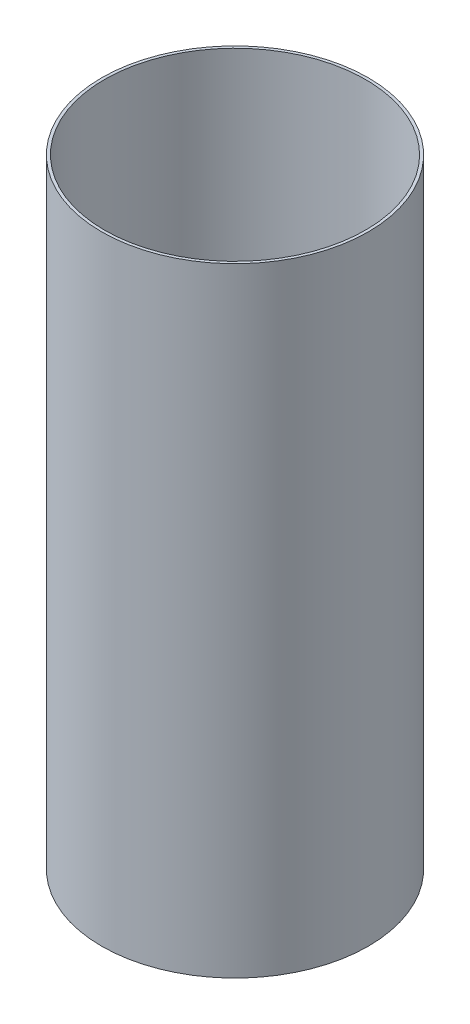
ISO-10303-21;
HEADER;
FILE_DESCRIPTION(('STEP AP214'),'2;1');
FILE_NAME('part.step','',(''),(''),'','','');
FILE_SCHEMA(('AUTOMOTIVE_DESIGN { 1 0 10303 214 1 1 1 1 }'));
ENDSEC;
DATA;
#1=APPLICATION_CONTEXT('core data for automotive mechanical design processes');
#2=APPLICATION_PROTOCOL_DEFINITION('international standard','automotive_design',2000,#1);
#3=PRODUCT_CONTEXT('',#1,'mechanical');
#4=PRODUCT('Part','Part','',(#3));
#5=PRODUCT_RELATED_PRODUCT_CATEGORY('part','',(#4));
#6=PRODUCT_DEFINITION_FORMATION('','',#4);
#7=PRODUCT_DEFINITION_CONTEXT('part definition',#1,'design');
#8=PRODUCT_DEFINITION('design','',#6,#7);
#9=PRODUCT_DEFINITION_SHAPE('','',#8);
#10=(LENGTH_UNIT() NAMED_UNIT(*) SI_UNIT(.MILLI.,.METRE.));
#11=(NAMED_UNIT(*) PLANE_ANGLE_UNIT() SI_UNIT($,.RADIAN.));
#12=(NAMED_UNIT(*) SI_UNIT($,.STERADIAN.) SOLID_ANGLE_UNIT());
#13=UNCERTAINTY_MEASURE_WITH_UNIT(LENGTH_MEASURE(1.E-05),#10,'distance_accuracy_value','');
#14=(GEOMETRIC_REPRESENTATION_CONTEXT(3) GLOBAL_UNCERTAINTY_ASSIGNED_CONTEXT((#13)) GLOBAL_UNIT_ASSIGNED_CONTEXT((#10,
#11,#12)) REPRESENTATION_CONTEXT('',''));
#15=CARTESIAN_POINT('',(0.,0.,0.));
#16=DIRECTION('',(0.,0.,1.));
#17=DIRECTION('',(1.,0.,0.));
#18=AXIS2_PLACEMENT_3D('',#15,#16,#17);
#19=CARTESIAN_POINT('',(0.,-181.7,0.));
#20=DIRECTION('',(0.,1.,0.));
#21=DIRECTION('',(0.,0.,1.));
#22=AXIS2_PLACEMENT_3D('',#19,#20,#21);
#23=CYLINDRICAL_SURFACE('',#22,78.35);
#24=CARTESIAN_POINT('',(0.,-181.7,0.));
#25=DIRECTION('',(0.,1.,0.));
#26=DIRECTION('',(0.,0.,1.));
#27=AXIS2_PLACEMENT_3D('',#24,#25,#26);
#28=CIRCLE('',#27,78.35);
#29=CARTESIAN_POINT('',(0.,-181.7,78.35));
#30=VERTEX_POINT('',#29);
#31=EDGE_CURVE('E10',#30,#30,#28,.T.);
#32=CARTESIAN_POINT('',(0.,181.7,0.));
#33=DIRECTION('',(0.,1.,0.));
#34=DIRECTION('',(0.,0.,1.));
#35=AXIS2_PLACEMENT_3D('',#32,#33,#34);
#36=CIRCLE('',#35,78.35);
#37=CARTESIAN_POINT('',(0.,181.7,78.35));
#38=VERTEX_POINT('',#37);
#39=EDGE_CURVE('E50',#38,#38,#36,.T.);
#40=CARTESIAN_POINT('',(0.,-181.7,78.35));
#41=CARTESIAN_POINT('',(0.,-177.914583333333,78.35));
#42=CARTESIAN_POINT('',(0.,-174.129166666667,78.35));
#43=CARTESIAN_POINT('',(0.,-166.558333333333,78.35));
#44=CARTESIAN_POINT('',(0.,-162.772916666667,78.35));
#45=CARTESIAN_POINT('',(0.,-155.202083333333,78.35));
#46=CARTESIAN_POINT('',(0.,-151.416666666667,78.35));
#47=CARTESIAN_POINT('',(0.,-143.845833333333,78.35));
#48=CARTESIAN_POINT('',(0.,-140.060416666667,78.35));
#49=CARTESIAN_POINT('',(0.,-132.489583333333,78.35));
#50=CARTESIAN_POINT('',(0.,-128.704166666667,78.35));
#51=CARTESIAN_POINT('',(0.,-121.133333333333,78.35));
#52=CARTESIAN_POINT('',(0.,-117.347916666667,78.35));
#53=CARTESIAN_POINT('',(0.,-109.777083333333,78.35));
#54=CARTESIAN_POINT('',(0.,-105.991666666667,78.35));
#55=CARTESIAN_POINT('',(0.,-98.4208333333333,78.35));
#56=CARTESIAN_POINT('',(0.,-94.6354166666667,78.35));
#57=CARTESIAN_POINT('',(0.,-87.0645833333333,78.35));
#58=CARTESIAN_POINT('',(0.,-83.2791666666667,78.35));
#59=CARTESIAN_POINT('',(0.,-75.7083333333333,78.35));
#60=CARTESIAN_POINT('',(0.,-71.9229166666667,78.35));
#61=CARTESIAN_POINT('',(0.,-64.3520833333334,78.35));
#62=CARTESIAN_POINT('',(0.,-60.5666666666667,78.35));
#63=CARTESIAN_POINT('',(0.,-52.9958333333333,78.35));
#64=CARTESIAN_POINT('',(0.,-49.2104166666667,78.35));
#65=CARTESIAN_POINT('',(0.,-41.6395833333334,78.35));
#66=CARTESIAN_POINT('',(0.,-37.8541666666667,78.35));
#67=CARTESIAN_POINT('',(0.,-30.2833333333334,78.35));
#68=CARTESIAN_POINT('',(0.,-26.4979166666667,78.35));
#69=CARTESIAN_POINT('',(0.,-18.9270833333334,78.35));
#70=CARTESIAN_POINT('',(0.,-15.1416666666667,78.35));
#71=CARTESIAN_POINT('',(0.,-7.57083333333337,78.35));
#72=CARTESIAN_POINT('',(0.,-3.7854166666667,78.35));
#73=CARTESIAN_POINT('',(0.,3.78541666666664,78.35));
#74=CARTESIAN_POINT('',(0.,7.57083333333331,78.35));
#75=CARTESIAN_POINT('',(0.,15.1416666666666,78.35));
#76=CARTESIAN_POINT('',(0.,18.9270833333333,78.35));
#77=CARTESIAN_POINT('',(0.,26.4979166666666,78.35));
#78=CARTESIAN_POINT('',(0.,30.2833333333333,78.35));
#79=CARTESIAN_POINT('',(0.,37.8541666666666,78.35));
#80=CARTESIAN_POINT('',(0.,41.6395833333333,78.35));
#81=CARTESIAN_POINT('',(0.,49.2104166666666,78.35));
#82=CARTESIAN_POINT('',(0.,52.9958333333333,78.35));
#83=CARTESIAN_POINT('',(0.,60.5666666666666,78.35));
#84=CARTESIAN_POINT('',(0.,64.3520833333333,78.35));
#85=CARTESIAN_POINT('',(0.,71.9229166666667,78.35));
#86=CARTESIAN_POINT('',(0.,75.7083333333333,78.35));
#87=CARTESIAN_POINT('',(0.,83.2791666666667,78.35));
#88=CARTESIAN_POINT('',(0.,87.0645833333333,78.35));
#89=CARTESIAN_POINT('',(0.,94.6354166666667,78.35));
#90=CARTESIAN_POINT('',(0.,98.4208333333333,78.35));
#91=CARTESIAN_POINT('',(0.,105.991666666667,78.35));
#92=CARTESIAN_POINT('',(0.,109.777083333333,78.35));
#93=CARTESIAN_POINT('',(0.,117.347916666667,78.35));
#94=CARTESIAN_POINT('',(0.,121.133333333333,78.35));
#95=CARTESIAN_POINT('',(0.,128.704166666667,78.35));
#96=CARTESIAN_POINT('',(0.,132.489583333333,78.35));
#97=CARTESIAN_POINT('',(0.,140.060416666667,78.35));
#98=CARTESIAN_POINT('',(0.,143.845833333333,78.35));
#99=CARTESIAN_POINT('',(0.,151.416666666667,78.35));
#100=CARTESIAN_POINT('',(0.,155.202083333333,78.35));
#101=CARTESIAN_POINT('',(0.,162.772916666667,78.35));
#102=CARTESIAN_POINT('',(0.,166.558333333333,78.35));
#103=CARTESIAN_POINT('',(0.,174.129166666667,78.35));
#104=CARTESIAN_POINT('',(0.,177.914583333333,78.35));
#105=CARTESIAN_POINT('',(0.,181.7,78.35));
#106=B_SPLINE_CURVE_WITH_KNOTS('',3,(#40,#41,#42,#43,#44,#45,#46,#47,#48,#49,#50,#51,#52,#53,
#54,#55,#56,#57,#58,#59,#60,#61,#62,#63,#64,#65,#66,#67,#68,#69,#70,#71,#72,#73,#74,#75,#76,#77,
#78,#79,#80,#81,#82,#83,#84,#85,#86,#87,#88,#89,#90,#91,#92,#93,#94,#95,#96,#97,#98,#99,#100,
#101,#102,#103,#104,#105),.UNSPECIFIED.,.F.,.F.,(4,2,2,2,2,2,2,2,2,2,2,2,2,2,2,2,2,2,2,2,2,2,2,
2,2,2,2,2,2,2,2,2,4),(0.,11.35625,22.7125,34.06875,45.425,56.78125,68.1375,79.49375,90.85,
102.20625,113.5625,124.91875,136.275,147.63125,158.9875,170.34375,181.7,193.05625,204.4125,
215.76875,227.125,238.48125,249.8375,261.19375,272.55,283.90625,295.2625,306.61875,317.975,
329.33125,340.6875,352.04375,363.4),.UNSPECIFIED.);
#107=EDGE_CURVE('BSEAM38',#30,#38,#106,.T.);
#108=ORIENTED_EDGE('',*,*,#31,.T.);
#109=ORIENTED_EDGE('',*,*,#39,.F.);
#110=ORIENTED_EDGE('',*,*,#107,.T.);
#111=ORIENTED_EDGE('',*,*,#107,.F.);
#112=EDGE_LOOP('',(#108,#110,#109,#111));
#113=FACE_BOUND('',#112,.T.);
#114=ADVANCED_FACE('F38',(#113),#23,.T.);
#115=CARTESIAN_POINT('',(0.,-181.7,0.));
#116=DIRECTION('',(0.,1.,0.));
#117=DIRECTION('',(0.,0.,1.));
#118=AXIS2_PLACEMENT_3D('',#115,#116,#117);
#119=PLANE('',#118);
#120=CARTESIAN_POINT('',(0.,-181.7,0.));
#121=DIRECTION('',(0.,1.,0.));
#122=DIRECTION('',(0.,0.,1.));
#123=AXIS2_PLACEMENT_3D('',#120,#121,#122);
#124=CIRCLE('',#123,76.67);
#125=CARTESIAN_POINT('',(0.,-181.7,76.67));
#126=VERTEX_POINT('',#125);
#127=EDGE_CURVE('E45',#126,#126,#124,.T.);
#128=ORIENTED_EDGE('',*,*,#127,.T.);
#129=EDGE_LOOP('',(#128));
#130=FACE_BOUND('',#129,.T.);
#131=ORIENTED_EDGE('',*,*,#31,.F.);
#132=EDGE_LOOP('',(#131));
#133=FACE_BOUND('',#132,.T.);
#134=ADVANCED_FACE('F71',(#130,#133),#119,.F.);
#135=CARTESIAN_POINT('',(0.,-181.7,0.));
#136=DIRECTION('',(0.,1.,0.));
#137=DIRECTION('',(0.,0.,1.));
#138=AXIS2_PLACEMENT_3D('',#135,#136,#137);
#139=CYLINDRICAL_SURFACE('',#138,76.67);
#140=CARTESIAN_POINT('',(0.,181.7,0.));
#141=DIRECTION('',(0.,1.,0.));
#142=DIRECTION('',(0.,0.,1.));
#143=AXIS2_PLACEMENT_3D('',#140,#141,#142);
#144=CIRCLE('',#143,76.67);
#145=CARTESIAN_POINT('',(0.,181.7,76.67));
#146=VERTEX_POINT('',#145);
#147=EDGE_CURVE('E55',#146,#146,#144,.T.);
#148=CARTESIAN_POINT('',(0.,-181.7,76.67));
#149=CARTESIAN_POINT('',(0.,-177.914583333333,76.67));
#150=CARTESIAN_POINT('',(0.,-174.129166666667,76.67));
#151=CARTESIAN_POINT('',(0.,-166.558333333333,76.67));
#152=CARTESIAN_POINT('',(0.,-162.772916666667,76.67));
#153=CARTESIAN_POINT('',(0.,-155.202083333333,76.67));
#154=CARTESIAN_POINT('',(0.,-151.416666666667,76.67));
#155=CARTESIAN_POINT('',(0.,-143.845833333333,76.67));
#156=CARTESIAN_POINT('',(0.,-140.060416666667,76.67));
#157=CARTESIAN_POINT('',(0.,-132.489583333333,76.67));
#158=CARTESIAN_POINT('',(0.,-128.704166666667,76.67));
#159=CARTESIAN_POINT('',(0.,-121.133333333333,76.67));
#160=CARTESIAN_POINT('',(0.,-117.347916666667,76.67));
#161=CARTESIAN_POINT('',(0.,-109.777083333333,76.67));
#162=CARTESIAN_POINT('',(0.,-105.991666666667,76.67));
#163=CARTESIAN_POINT('',(0.,-98.4208333333333,76.67));
#164=CARTESIAN_POINT('',(0.,-94.6354166666667,76.67));
#165=CARTESIAN_POINT('',(0.,-87.0645833333333,76.67));
#166=CARTESIAN_POINT('',(0.,-83.2791666666667,76.67));
#167=CARTESIAN_POINT('',(0.,-75.7083333333333,76.67));
#168=CARTESIAN_POINT('',(0.,-71.9229166666667,76.67));
#169=CARTESIAN_POINT('',(0.,-64.3520833333334,76.67));
#170=CARTESIAN_POINT('',(0.,-60.5666666666667,76.67));
#171=CARTESIAN_POINT('',(0.,-52.9958333333333,76.67));
#172=CARTESIAN_POINT('',(0.,-49.2104166666667,76.67));
#173=CARTESIAN_POINT('',(0.,-41.6395833333334,76.67));
#174=CARTESIAN_POINT('',(0.,-37.8541666666667,76.67));
#175=CARTESIAN_POINT('',(0.,-30.2833333333334,76.67));
#176=CARTESIAN_POINT('',(0.,-26.4979166666667,76.67));
#177=CARTESIAN_POINT('',(0.,-18.9270833333334,76.67));
#178=CARTESIAN_POINT('',(0.,-15.1416666666667,76.67));
#179=CARTESIAN_POINT('',(0.,-7.57083333333337,76.67));
#180=CARTESIAN_POINT('',(0.,-3.7854166666667,76.67));
#181=CARTESIAN_POINT('',(0.,3.78541666666664,76.67));
#182=CARTESIAN_POINT('',(0.,7.57083333333331,76.67));
#183=CARTESIAN_POINT('',(0.,15.1416666666666,76.67));
#184=CARTESIAN_POINT('',(0.,18.9270833333333,76.67));
#185=CARTESIAN_POINT('',(0.,26.4979166666666,76.67));
#186=CARTESIAN_POINT('',(0.,30.2833333333333,76.67));
#187=CARTESIAN_POINT('',(0.,37.8541666666666,76.67));
#188=CARTESIAN_POINT('',(0.,41.6395833333333,76.67));
#189=CARTESIAN_POINT('',(0.,49.2104166666666,76.67));
#190=CARTESIAN_POINT('',(0.,52.9958333333333,76.67));
#191=CARTESIAN_POINT('',(0.,60.5666666666666,76.67));
#192=CARTESIAN_POINT('',(0.,64.3520833333333,76.67));
#193=CARTESIAN_POINT('',(0.,71.9229166666667,76.67));
#194=CARTESIAN_POINT('',(0.,75.7083333333333,76.67));
#195=CARTESIAN_POINT('',(0.,83.2791666666667,76.67));
#196=CARTESIAN_POINT('',(0.,87.0645833333333,76.67));
#197=CARTESIAN_POINT('',(0.,94.6354166666667,76.67));
#198=CARTESIAN_POINT('',(0.,98.4208333333333,76.67));
#199=CARTESIAN_POINT('',(0.,105.991666666667,76.67));
#200=CARTESIAN_POINT('',(0.,109.777083333333,76.67));
#201=CARTESIAN_POINT('',(0.,117.347916666667,76.67));
#202=CARTESIAN_POINT('',(0.,121.133333333333,76.67));
#203=CARTESIAN_POINT('',(0.,128.704166666667,76.67));
#204=CARTESIAN_POINT('',(0.,132.489583333333,76.67));
#205=CARTESIAN_POINT('',(0.,140.060416666667,76.67));
#206=CARTESIAN_POINT('',(0.,143.845833333333,76.67));
#207=CARTESIAN_POINT('',(0.,151.416666666667,76.67));
#208=CARTESIAN_POINT('',(0.,155.202083333333,76.67));
#209=CARTESIAN_POINT('',(0.,162.772916666667,76.67));
#210=CARTESIAN_POINT('',(0.,166.558333333333,76.67));
#211=CARTESIAN_POINT('',(0.,174.129166666667,76.67));
#212=CARTESIAN_POINT('',(0.,177.914583333333,76.67));
#213=CARTESIAN_POINT('',(0.,181.7,76.67));
#214=B_SPLINE_CURVE_WITH_KNOTS('',3,(#148,#149,#150,#151,#152,#153,#154,#155,#156,#157,#158,
#159,#160,#161,#162,#163,#164,#165,#166,#167,#168,#169,#170,#171,#172,#173,#174,#175,#176,#177,
#178,#179,#180,#181,#182,#183,#184,#185,#186,#187,#188,#189,#190,#191,#192,#193,#194,#195,#196,
#197,#198,#199,#200,#201,#202,#203,#204,#205,#206,#207,#208,#209,#210,#211,#212,#213),
.UNSPECIFIED.,.F.,.F.,(4,2,2,2,2,2,2,2,2,2,2,2,2,2,2,2,2,2,2,2,2,2,2,2,2,2,2,2,2,2,2,2,4),(0.,
11.35625,22.7125,34.06875,45.425,56.78125,68.1375,79.49375,90.85,102.20625,113.5625,124.91875,
136.275,147.63125,158.9875,170.34375,181.7,193.05625,204.4125,215.76875,227.125,238.48125,
249.8375,261.19375,272.55,283.90625,295.2625,306.61875,317.975,329.33125,340.6875,352.04375,
363.4),.UNSPECIFIED.);
#215=EDGE_CURVE('BSEAM62',#126,#146,#214,.T.);
#216=ORIENTED_EDGE('',*,*,#127,.F.);
#217=ORIENTED_EDGE('',*,*,#147,.T.);
#218=ORIENTED_EDGE('',*,*,#215,.T.);
#219=ORIENTED_EDGE('',*,*,#215,.F.);
#220=EDGE_LOOP('',(#216,#218,#217,#219));
#221=FACE_BOUND('',#220,.T.);
#222=ADVANCED_FACE('F62',(#221),#139,.F.);
#223=CARTESIAN_POINT('',(0.,181.7,0.));
#224=DIRECTION('',(0.,1.,0.));
#225=DIRECTION('',(0.,0.,1.));
#226=AXIS2_PLACEMENT_3D('',#223,#224,#225);
#227=PLANE('',#226);
#228=ORIENTED_EDGE('',*,*,#39,.T.);
#229=EDGE_LOOP('',(#228));
#230=FACE_BOUND('',#229,.T.);
#231=ORIENTED_EDGE('',*,*,#147,.F.);
#232=EDGE_LOOP('',(#231));
#233=FACE_BOUND('',#232,.T.);
#234=ADVANCED_FACE('F64',(#230,#233),#227,.T.);
#235=CLOSED_SHELL('',(#114,#134,#222,#234));
#236=MANIFOLD_SOLID_BREP('B2',#235);
#237=ADVANCED_BREP_SHAPE_REPRESENTATION('',(#18,#236),#14);
#238=SHAPE_DEFINITION_REPRESENTATION(#9,#237);
ENDSEC;
END-ISO-10303-21;
